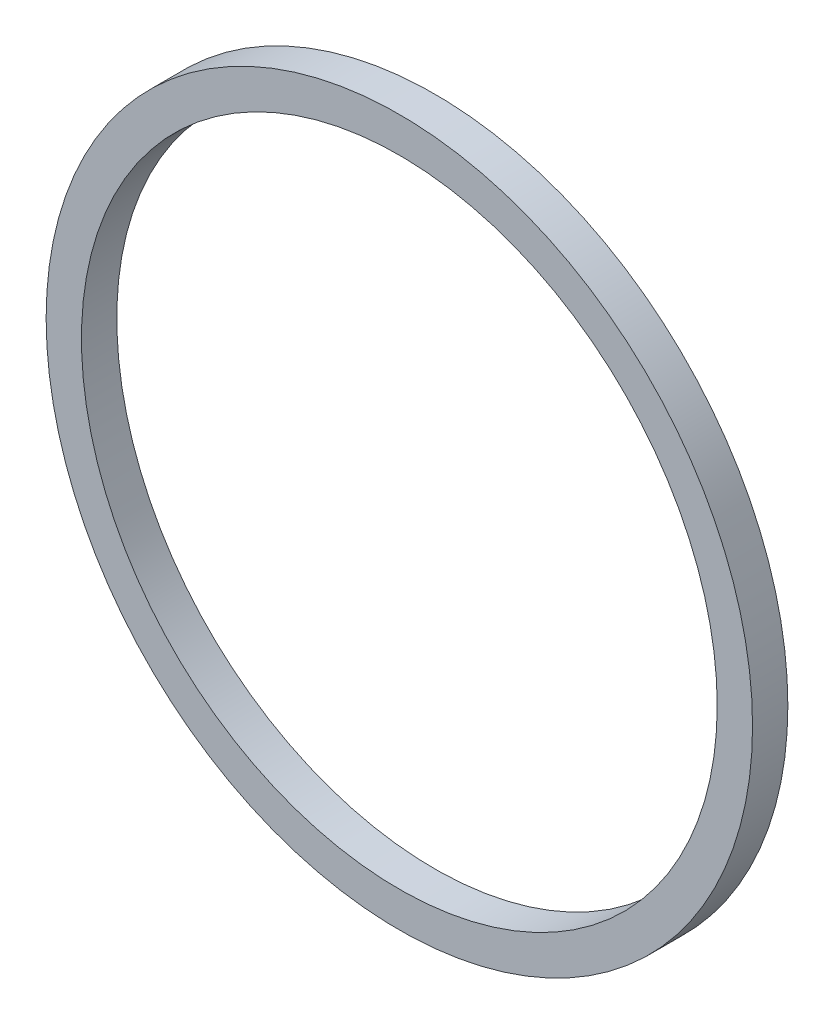
ISO-10303-21;
HEADER;
FILE_DESCRIPTION(('STEP AP214'),'2;1');
FILE_NAME('part.step','',(''),(''),'','','');
FILE_SCHEMA(('AUTOMOTIVE_DESIGN { 1 0 10303 214 1 1 1 1 }'));
ENDSEC;
DATA;
#1=APPLICATION_CONTEXT('core data for automotive mechanical design processes');
#2=APPLICATION_PROTOCOL_DEFINITION('international standard','automotive_design',2000,#1);
#3=PRODUCT_CONTEXT('',#1,'mechanical');
#4=PRODUCT('Part','Part','',(#3));
#5=PRODUCT_RELATED_PRODUCT_CATEGORY('part','',(#4));
#6=PRODUCT_DEFINITION_FORMATION('','',#4);
#7=PRODUCT_DEFINITION_CONTEXT('part definition',#1,'design');
#8=PRODUCT_DEFINITION('design','',#6,#7);
#9=PRODUCT_DEFINITION_SHAPE('','',#8);
#10=(LENGTH_UNIT() NAMED_UNIT(*) SI_UNIT(.MILLI.,.METRE.));
#11=(NAMED_UNIT(*) PLANE_ANGLE_UNIT() SI_UNIT($,.RADIAN.));
#12=(NAMED_UNIT(*) SI_UNIT($,.STERADIAN.) SOLID_ANGLE_UNIT());
#13=UNCERTAINTY_MEASURE_WITH_UNIT(LENGTH_MEASURE(1.E-05),#10,'distance_accuracy_value','');
#14=(GEOMETRIC_REPRESENTATION_CONTEXT(3) GLOBAL_UNCERTAINTY_ASSIGNED_CONTEXT((#13)) GLOBAL_UNIT_ASSIGNED_CONTEXT((#10,
#11,#12)) REPRESENTATION_CONTEXT('',''));
#15=CARTESIAN_POINT('',(0.,0.,0.));
#16=DIRECTION('',(0.,0.,1.));
#17=DIRECTION('',(1.,0.,0.));
#18=AXIS2_PLACEMENT_3D('',#15,#16,#17);
#19=CARTESIAN_POINT('',(0.,0.,6.35));
#20=DIRECTION('',(0.,0.,1.));
#21=DIRECTION('',(1.,0.,0.));
#22=AXIS2_PLACEMENT_3D('',#19,#20,#21);
#23=PLANE('',#22);
#24=CARTESIAN_POINT('',(0.,0.,6.35));
#25=DIRECTION('',(0.,0.,1.));
#26=DIRECTION('',(1.,0.,0.));
#27=AXIS2_PLACEMENT_3D('',#24,#25,#26);
#28=CIRCLE('',#27,63.5);
#29=CARTESIAN_POINT('',(63.5,0.,6.35));
#30=VERTEX_POINT('',#29);
#31=EDGE_CURVE('E10',#30,#30,#28,.T.);
#32=ORIENTED_EDGE('',*,*,#31,.T.);
#33=EDGE_LOOP('',(#32));
#34=FACE_BOUND('',#33,.T.);
#35=CARTESIAN_POINT('',(0.,0.,6.35));
#36=DIRECTION('',(0.,0.,1.));
#37=DIRECTION('',(1.,0.,0.));
#38=AXIS2_PLACEMENT_3D('',#35,#36,#37);
#39=CIRCLE('',#38,57.15);
#40=CARTESIAN_POINT('',(57.15,0.,6.35));
#41=VERTEX_POINT('',#40);
#42=EDGE_CURVE('E45',#41,#41,#39,.T.);
#43=ORIENTED_EDGE('',*,*,#42,.F.);
#44=EDGE_LOOP('',(#43));
#45=FACE_BOUND('',#44,.T.);
#46=ADVANCED_FACE('F34',(#34,#45),#23,.T.);
#47=CARTESIAN_POINT('',(0.,0.,0.));
#48=DIRECTION('',(0.,0.,1.));
#49=DIRECTION('',(1.,0.,0.));
#50=AXIS2_PLACEMENT_3D('',#47,#48,#49);
#51=PLANE('',#50);
#52=CARTESIAN_POINT('',(0.,0.,0.));
#53=DIRECTION('',(0.,0.,1.));
#54=DIRECTION('',(1.,0.,0.));
#55=AXIS2_PLACEMENT_3D('',#52,#53,#54);
#56=CIRCLE('',#55,63.5);
#57=CARTESIAN_POINT('',(63.5,0.,0.));
#58=VERTEX_POINT('',#57);
#59=EDGE_CURVE('E38',#58,#58,#56,.T.);
#60=ORIENTED_EDGE('',*,*,#59,.F.);
#61=EDGE_LOOP('',(#60));
#62=FACE_BOUND('',#61,.T.);
#63=CARTESIAN_POINT('',(0.,0.,0.));
#64=DIRECTION('',(0.,0.,1.));
#65=DIRECTION('',(1.,0.,0.));
#66=AXIS2_PLACEMENT_3D('',#63,#64,#65);
#67=CIRCLE('',#66,57.15);
#68=CARTESIAN_POINT('',(57.15,0.,0.));
#69=VERTEX_POINT('',#68);
#70=EDGE_CURVE('E47',#69,#69,#67,.T.);
#71=ORIENTED_EDGE('',*,*,#70,.T.);
#72=EDGE_LOOP('',(#71));
#73=FACE_BOUND('',#72,.T.);
#74=ADVANCED_FACE('F57',(#62,#73),#51,.F.);
#75=CARTESIAN_POINT('',(0.,0.,6.35));
#76=DIRECTION('',(0.,0.,-1.));
#77=DIRECTION('',(-1.,0.,0.));
#78=AXIS2_PLACEMENT_3D('',#75,#76,#77);
#79=CYLINDRICAL_SURFACE('',#78,63.5);
#80=ORIENTED_EDGE('',*,*,#31,.F.);
#81=EDGE_LOOP('',(#80));
#82=FACE_BOUND('',#81,.T.);
#83=ORIENTED_EDGE('',*,*,#59,.T.);
#84=EDGE_LOOP('',(#83));
#85=FACE_BOUND('',#84,.T.);
#86=ADVANCED_FACE('F36',(#82,#85),#79,.T.);
#87=CARTESIAN_POINT('',(0.,0.,6.35));
#88=DIRECTION('',(0.,0.,-1.));
#89=DIRECTION('',(-1.,0.,0.));
#90=AXIS2_PLACEMENT_3D('',#87,#88,#89);
#91=CYLINDRICAL_SURFACE('',#90,57.15);
#92=ORIENTED_EDGE('',*,*,#42,.T.);
#93=EDGE_LOOP('',(#92));
#94=FACE_BOUND('',#93,.T.);
#95=ORIENTED_EDGE('',*,*,#70,.F.);
#96=EDGE_LOOP('',(#95));
#97=FACE_BOUND('',#96,.T.);
#98=ADVANCED_FACE('F53',(#94,#97),#91,.F.);
#99=CLOSED_SHELL('',(#46,#74,#86,#98));
#100=MANIFOLD_SOLID_BREP('B2',#99);
#101=ADVANCED_BREP_SHAPE_REPRESENTATION('',(#18,#100),#14);
#102=SHAPE_DEFINITION_REPRESENTATION(#9,#101);
ENDSEC;
END-ISO-10303-21;
